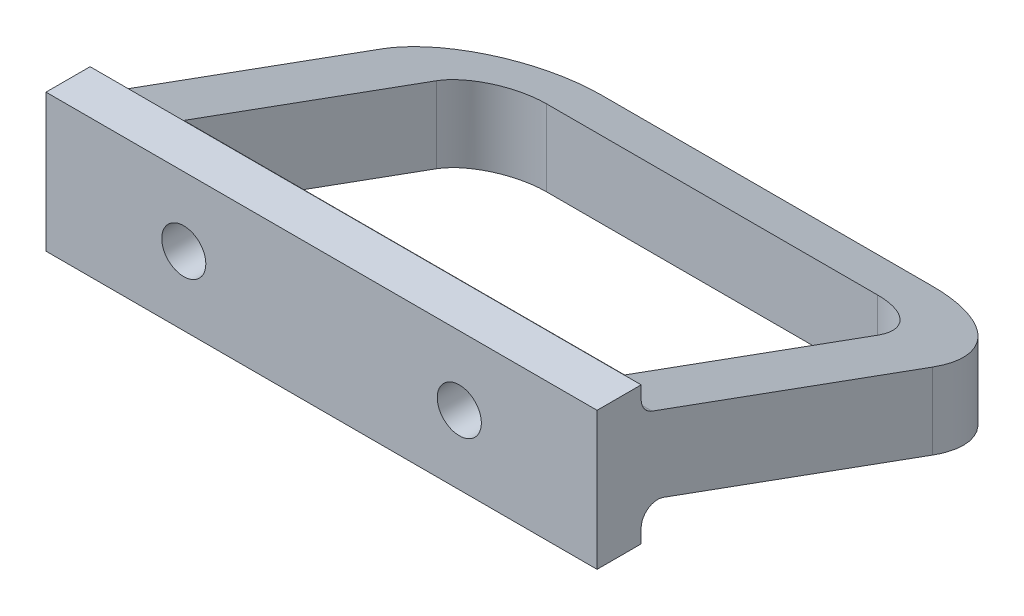
ISO-10303-21;
HEADER;
FILE_DESCRIPTION(('STEP AP214'),'2;1');
FILE_NAME('part.step','',(''),(''),'','','');
FILE_SCHEMA(('AUTOMOTIVE_DESIGN { 1 0 10303 214 1 1 1 1 }'));
ENDSEC;
DATA;
#1=APPLICATION_CONTEXT('core data for automotive mechanical design processes');
#2=APPLICATION_PROTOCOL_DEFINITION('international standard','automotive_design',2000,#1);
#3=PRODUCT_CONTEXT('',#1,'mechanical');
#4=PRODUCT('Part','Part','',(#3));
#5=PRODUCT_RELATED_PRODUCT_CATEGORY('part','',(#4));
#6=PRODUCT_DEFINITION_FORMATION('','',#4);
#7=PRODUCT_DEFINITION_CONTEXT('part definition',#1,'design');
#8=PRODUCT_DEFINITION('design','',#6,#7);
#9=PRODUCT_DEFINITION_SHAPE('','',#8);
#10=(LENGTH_UNIT() NAMED_UNIT(*) SI_UNIT(.MILLI.,.METRE.));
#11=(NAMED_UNIT(*) PLANE_ANGLE_UNIT() SI_UNIT($,.RADIAN.));
#12=(NAMED_UNIT(*) SI_UNIT($,.STERADIAN.) SOLID_ANGLE_UNIT());
#13=UNCERTAINTY_MEASURE_WITH_UNIT(LENGTH_MEASURE(1.E-05),#10,'distance_accuracy_value','');
#14=(GEOMETRIC_REPRESENTATION_CONTEXT(3) GLOBAL_UNCERTAINTY_ASSIGNED_CONTEXT((#13)) GLOBAL_UNIT_ASSIGNED_CONTEXT((#10,
#11,#12)) REPRESENTATION_CONTEXT('',''));
#15=CARTESIAN_POINT('',(0.,0.,0.));
#16=DIRECTION('',(0.,0.,1.));
#17=DIRECTION('',(1.,0.,0.));
#18=AXIS2_PLACEMENT_3D('',#15,#16,#17);
#19=CARTESIAN_POINT('',(-100.,12.5,0.));
#20=DIRECTION('',(0.,0.,1.));
#21=DIRECTION('',(0.,-1.,0.));
#22=AXIS2_PLACEMENT_3D('',#19,#20,#21);
#23=PLANE('',#22);
#24=CARTESIAN_POINT('',(-75.,0.,0.));
#25=DIRECTION('',(0.,0.,1.));
#26=DIRECTION('',(1.,0.,0.));
#27=AXIS2_PLACEMENT_3D('',#24,#25,#26);
#28=CIRCLE('',#27,4.00000000000001);
#29=CARTESIAN_POINT('',(-71.,0.,0.));
#30=VERTEX_POINT('',#29);
#31=EDGE_CURVE('E206',#30,#30,#28,.T.);
#32=ORIENTED_EDGE('',*,*,#31,.F.);
#33=EDGE_LOOP('',(#32));
#34=FACE_BOUND('',#33,.T.);
#35=CARTESIAN_POINT('',(-25.,0.,0.));
#36=DIRECTION('',(0.,0.,1.));
#37=DIRECTION('',(1.,0.,0.));
#38=AXIS2_PLACEMENT_3D('',#35,#36,#37);
#39=CIRCLE('',#38,4.);
#40=CARTESIAN_POINT('',(-21.,0.,0.));
#41=VERTEX_POINT('',#40);
#42=EDGE_CURVE('E210',#41,#41,#39,.T.);
#43=ORIENTED_EDGE('',*,*,#42,.F.);
#44=EDGE_LOOP('',(#43));
#45=FACE_BOUND('',#44,.T.);
#46=DIRECTION('',(0.,-1.,0.));
#47=VECTOR('',#46,1.);
#48=CARTESIAN_POINT('',(0.,12.5,0.));
#49=LINE('',#48,#47);
#50=CARTESIAN_POINT('',(0.,12.5,0.));
#51=VERTEX_POINT('',#50);
#52=CARTESIAN_POINT('',(0.,-12.5,0.));
#53=VERTEX_POINT('',#52);
#54=EDGE_CURVE('E258',#51,#53,#49,.T.);
#55=ORIENTED_EDGE('',*,*,#54,.F.);
#56=DIRECTION('',(1.,0.,0.));
#57=VECTOR('',#56,1.);
#58=CARTESIAN_POINT('',(-100.,12.5,0.));
#59=LINE('',#58,#57);
#60=CARTESIAN_POINT('',(-100.,12.5,0.));
#61=VERTEX_POINT('',#60);
#62=EDGE_CURVE('E327',#61,#51,#59,.T.);
#63=ORIENTED_EDGE('',*,*,#62,.F.);
#64=DIRECTION('',(0.,-1.,0.));
#65=VECTOR('',#64,1.);
#66=CARTESIAN_POINT('',(-100.,12.5,0.));
#67=LINE('',#66,#65);
#68=CARTESIAN_POINT('',(-100.,-12.5,0.));
#69=VERTEX_POINT('',#68);
#70=EDGE_CURVE('E259',#61,#69,#67,.T.);
#71=ORIENTED_EDGE('',*,*,#70,.T.);
#72=DIRECTION('',(1.,0.,0.));
#73=VECTOR('',#72,1.);
#74=CARTESIAN_POINT('',(-100.,-12.5,0.));
#75=LINE('',#74,#73);
#76=EDGE_CURVE('E294',#69,#53,#75,.T.);
#77=ORIENTED_EDGE('',*,*,#76,.T.);
#78=EDGE_LOOP('',(#55,#63,#71,#77));
#79=FACE_BOUND('',#78,.T.);
#80=ADVANCED_FACE('F45',(#34,#45,#79),#23,.T.);
#81=CARTESIAN_POINT('',(-100.,12.5,-8.));
#82=DIRECTION('',(0.,1.,0.));
#83=DIRECTION('',(0.,0.,1.));
#84=AXIS2_PLACEMENT_3D('',#81,#82,#83);
#85=PLANE('',#84);
#86=DIRECTION('',(0.,0.,1.));
#87=VECTOR('',#86,1.);
#88=CARTESIAN_POINT('',(0.,12.5,-8.));
#89=LINE('',#88,#87);
#90=CARTESIAN_POINT('',(0.,12.5,-8.));
#91=VERTEX_POINT('',#90);
#92=EDGE_CURVE('E264',#91,#51,#89,.T.);
#93=ORIENTED_EDGE('',*,*,#92,.F.);
#94=DIRECTION('',(1.,0.,0.));
#95=VECTOR('',#94,1.);
#96=CARTESIAN_POINT('',(-100.,12.5,-8.));
#97=LINE('',#96,#95);
#98=CARTESIAN_POINT('',(-100.,12.5,-8.));
#99=VERTEX_POINT('',#98);
#100=EDGE_CURVE('E331',#99,#91,#97,.T.);
#101=ORIENTED_EDGE('',*,*,#100,.F.);
#102=DIRECTION('',(0.,0.,1.));
#103=VECTOR('',#102,1.);
#104=CARTESIAN_POINT('',(-100.,12.5,-8.));
#105=LINE('',#104,#103);
#106=EDGE_CURVE('E290',#99,#61,#105,.T.);
#107=ORIENTED_EDGE('',*,*,#106,.T.);
#108=ORIENTED_EDGE('',*,*,#62,.T.);
#109=EDGE_LOOP('',(#93,#101,#107,#108));
#110=FACE_BOUND('',#109,.T.);
#111=ADVANCED_FACE('F411',(#110),#85,.T.);
#112=CARTESIAN_POINT('',(-100.,10.2002998146846,-8.00000000000001));
#113=DIRECTION('',(0.,0.,-1.));
#114=DIRECTION('',(0.,1.,0.));
#115=AXIS2_PLACEMENT_3D('',#112,#113,#114);
#116=PLANE('',#115);
#117=DIRECTION('',(0.,1.,0.));
#118=VECTOR('',#117,1.);
#119=CARTESIAN_POINT('',(0.,10.2002998146846,-8.00000000000001));
#120=LINE('',#119,#118);
#121=CARTESIAN_POINT('',(0.,10.2002998146846,-8.00000000000003));
#122=VERTEX_POINT('',#121);
#123=EDGE_CURVE('E320',#122,#91,#120,.T.);
#124=ORIENTED_EDGE('',*,*,#123,.F.);
#125=DIRECTION('',(1.,0.,0.));
#126=VECTOR('',#125,1.);
#127=CARTESIAN_POINT('',(-100.,10.2002998146846,-8.00000000000003));
#128=LINE('',#127,#126);
#129=CARTESIAN_POINT('',(-100.,10.2002998146846,-8.00000000000003));
#130=VERTEX_POINT('',#129);
#131=EDGE_CURVE('E334',#130,#122,#128,.T.);
#132=ORIENTED_EDGE('',*,*,#131,.F.);
#133=DIRECTION('',(0.,1.,0.));
#134=VECTOR('',#133,1.);
#135=CARTESIAN_POINT('',(-100.,10.2002998146846,-8.00000000000001));
#136=LINE('',#135,#134);
#137=EDGE_CURVE('E286',#130,#99,#136,.T.);
#138=ORIENTED_EDGE('',*,*,#137,.T.);
#139=ORIENTED_EDGE('',*,*,#100,.T.);
#140=EDGE_LOOP('',(#124,#132,#138,#139));
#141=FACE_BOUND('',#140,.T.);
#142=ADVANCED_FACE('F418',(#141),#116,.T.);
#143=CARTESIAN_POINT('',(-100.,10.2002998146846,-11.));
#144=DIRECTION('',(1.,0.,0.));
#145=DIRECTION('',(0.,0.,-1.));
#146=AXIS2_PLACEMENT_3D('',#143,#144,#145);
#147=CYLINDRICAL_SURFACE('',#146,2.99999999999997);
#148=CARTESIAN_POINT('',(0.,10.2002998146846,-11.));
#149=DIRECTION('',(-1.,0.,0.));
#150=DIRECTION('',(0.,0.,1.));
#151=AXIS2_PLACEMENT_3D('',#148,#149,#150);
#152=CIRCLE('',#151,2.99999999999997);
#153=CARTESIAN_POINT('',(0.,7.3812219523269,-9.97393957002299));
#154=VERTEX_POINT('',#153);
#155=EDGE_CURVE('E316',#154,#122,#152,.T.);
#156=ORIENTED_EDGE('',*,*,#155,.F.);
#157=DIRECTION('',(1.,0.,0.));
#158=VECTOR('',#157,1.);
#159=CARTESIAN_POINT('',(-100.,7.3812219523269,-9.97393957002299));
#160=LINE('',#159,#158);
#161=CARTESIAN_POINT('',(-100.,7.3812219523269,-9.97393957002299));
#162=VERTEX_POINT('',#161);
#163=EDGE_CURVE('E337',#162,#154,#160,.T.);
#164=ORIENTED_EDGE('',*,*,#163,.F.);
#165=CARTESIAN_POINT('',(-100.,10.2002998146846,-11.));
#166=DIRECTION('',(-1.,0.,0.));
#167=DIRECTION('',(0.,0.,1.));
#168=AXIS2_PLACEMENT_3D('',#165,#166,#167);
#169=CIRCLE('',#168,2.99999999999997);
#170=EDGE_CURVE('E282',#162,#130,#169,.T.);
#171=ORIENTED_EDGE('',*,*,#170,.T.);
#172=ORIENTED_EDGE('',*,*,#131,.T.);
#173=EDGE_LOOP('',(#156,#164,#171,#172));
#174=FACE_BOUND('',#173,.T.);
#175=ADVANCED_FACE('F393',(#174),#147,.F.);
#176=CARTESIAN_POINT('',(-100.,-18.4156889578132,-80.8503697873148));
#177=DIRECTION('',(0.,0.939692620785907,-0.342020143325672));
#178=DIRECTION('',(0.,0.342020143325672,0.939692620785907));
#179=AXIS2_PLACEMENT_3D('',#176,#177,#178);
#180=PLANE('',#179);
#181=DIRECTION('',(0.,-0.342020143325672,-0.939692620785907));
#182=VECTOR('',#181,1.);
#183=CARTESIAN_POINT('',(-10.,-18.4156889578132,-80.8503697873148));
#184=LINE('',#183,#182);
#185=CARTESIAN_POINT('',(-9.99999999999999,5.55188556019204,-15.));
#186=VERTEX_POINT('',#185);
#187=CARTESIAN_POINT('',(-10.,-11.1362842724891,-60.8503697873148));
#188=VERTEX_POINT('',#187);
#189=EDGE_CURVE('E195',#186,#188,#184,.T.);
#190=ORIENTED_EDGE('',*,*,#189,.F.);
#191=DIRECTION('',(1.,0.,0.));
#192=VECTOR('',#191,1.);
#193=CARTESIAN_POINT('',(-100.,5.55188556019206,-15.));
#194=LINE('',#193,#192);
#195=CARTESIAN_POINT('',(-90.,5.55188556019206,-15.));
#196=VERTEX_POINT('',#195);
#197=EDGE_CURVE('E240',#196,#186,#194,.T.);
#198=ORIENTED_EDGE('',*,*,#197,.F.);
#199=DIRECTION('',(0.,0.342020143325672,0.939692620785907));
#200=VECTOR('',#199,1.);
#201=CARTESIAN_POINT('',(-90.,-18.4156889578132,-80.8503697873148));
#202=LINE('',#201,#200);
#203=CARTESIAN_POINT('',(-90.,-11.1362842724891,-60.8503697873148));
#204=VERTEX_POINT('',#203);
#205=EDGE_CURVE('E243',#204,#196,#202,.T.);
#206=ORIENTED_EDGE('',*,*,#205,.F.);
#207=CARTESIAN_POINT('',(-80.,-11.1362842724891,-60.8503697873148));
#208=DIRECTION('',(0.,0.939692620785907,-0.342020143325672));
#209=DIRECTION('',(0.,0.342020143325672,0.939692620785907));
#210=AXIS2_PLACEMENT_3D('',#207,#208,#209);
#211=ELLIPSE('',#210,10.6417777247591,10.);
#212=CARTESIAN_POINT('',(-80.,-14.7759866151511,-70.8503697873148));
#213=VERTEX_POINT('',#212);
#214=EDGE_CURVE('E247',#213,#204,#211,.T.);
#215=ORIENTED_EDGE('',*,*,#214,.F.);
#216=DIRECTION('',(-1.,0.,0.));
#217=VECTOR('',#216,1.);
#218=CARTESIAN_POINT('',(-100.,-14.7759866151511,-70.8503697873148));
#219=LINE('',#218,#217);
#220=CARTESIAN_POINT('',(-20.,-14.7759866151512,-70.8503697873148));
#221=VERTEX_POINT('',#220);
#222=EDGE_CURVE('E250',#221,#213,#219,.T.);
#223=ORIENTED_EDGE('',*,*,#222,.F.);
#224=CARTESIAN_POINT('',(-20.,-11.1362842724891,-60.8503697873148));
#225=DIRECTION('',(0.,0.939692620785907,-0.342020143325672));
#226=DIRECTION('',(0.,0.342020143325672,0.939692620785907));
#227=AXIS2_PLACEMENT_3D('',#224,#225,#226);
#228=ELLIPSE('',#227,10.6417777247591,10.);
#229=EDGE_CURVE('E253',#188,#221,#228,.T.);
#230=ORIENTED_EDGE('',*,*,#229,.F.);
#231=EDGE_LOOP('',(#190,#198,#206,#215,#223,#230));
#232=FACE_BOUND('',#231,.T.);
#233=DIRECTION('',(1.,0.,0.));
#234=VECTOR('',#233,1.);
#235=CARTESIAN_POINT('',(-100.,-18.4156889578132,-80.8503697873148));
#236=LINE('',#235,#234);
#237=CARTESIAN_POINT('',(-80.,-18.4156889578132,-80.8503697873148));
#238=VERTEX_POINT('',#237);
#239=CARTESIAN_POINT('',(-20.,-18.4156889578132,-80.8503697873148));
#240=VERTEX_POINT('',#239);
#241=EDGE_CURVE('E341',#238,#240,#236,.T.);
#242=ORIENTED_EDGE('',*,*,#241,.F.);
#243=CARTESIAN_POINT('',(-80.,-11.1362842724891,-60.8503697873148));
#244=DIRECTION('',(0.,0.939692620785907,-0.342020143325672));
#245=DIRECTION('',(0.,0.342020143325672,0.939692620785907));
#246=AXIS2_PLACEMENT_3D('',#243,#244,#245);
#247=ELLIPSE('',#246,21.2835554495183,20.);
#248=CARTESIAN_POINT('',(-100.,-11.1362842724891,-60.8503697873148));
#249=VERTEX_POINT('',#248);
#250=EDGE_CURVE('E368',#238,#249,#247,.T.);
#251=ORIENTED_EDGE('',*,*,#250,.T.);
#252=DIRECTION('',(0.,0.342020143325672,0.939692620785907));
#253=VECTOR('',#252,1.);
#254=CARTESIAN_POINT('',(-100.,-18.4156889578132,-80.8503697873148));
#255=LINE('',#254,#253);
#256=EDGE_CURVE('E279',#249,#162,#255,.T.);
#257=ORIENTED_EDGE('',*,*,#256,.T.);
#258=ORIENTED_EDGE('',*,*,#163,.T.);
#259=DIRECTION('',(0.,0.342020143325672,0.939692620785907));
#260=VECTOR('',#259,1.);
#261=CARTESIAN_POINT('',(0.,-18.4156889578132,-80.8503697873148));
#262=LINE('',#261,#260);
#263=CARTESIAN_POINT('',(0.,-11.1362842724891,-60.8503697873148));
#264=VERTEX_POINT('',#263);
#265=EDGE_CURVE('E313',#264,#154,#262,.T.);
#266=ORIENTED_EDGE('',*,*,#265,.F.);
#267=CARTESIAN_POINT('',(-20.,-11.1362842724891,-60.8503697873148));
#268=DIRECTION('',(0.,0.939692620785907,-0.342020143325672));
#269=DIRECTION('',(0.,-0.342020143325672,-0.939692620785907));
#270=AXIS2_PLACEMENT_3D('',#267,#268,#269);
#271=ELLIPSE('',#270,21.2835554495183,20.);
#272=EDGE_CURVE('E365',#264,#240,#271,.T.);
#273=ORIENTED_EDGE('',*,*,#272,.T.);
#274=EDGE_LOOP('',(#242,#251,#257,#258,#266,#273));
#275=FACE_BOUND('',#274,.T.);
#276=ADVANCED_FACE('F385',(#232,#275),#180,.T.);
#277=CARTESIAN_POINT('',(-100.,-32.2500000000001,-80.8503697873148));
#278=DIRECTION('',(0.,0.,-1.));
#279=DIRECTION('',(-1.,0.,0.));
#280=AXIS2_PLACEMENT_3D('',#277,#278,#279);
#281=PLANE('',#280);
#282=DIRECTION('',(1.,0.,0.));
#283=VECTOR('',#282,1.);
#284=CARTESIAN_POINT('',(-100.,-32.2500000000001,-80.8503697873148));
#285=LINE('',#284,#283);
#286=CARTESIAN_POINT('',(-80.,-32.2500000000001,-80.8503697873148));
#287=VERTEX_POINT('',#286);
#288=CARTESIAN_POINT('',(-20.,-32.2500000000001,-80.8503697873148));
#289=VERTEX_POINT('',#288);
#290=EDGE_CURVE('E345',#287,#289,#285,.T.);
#291=ORIENTED_EDGE('',*,*,#290,.F.);
#292=DIRECTION('',(0.,1.,0.));
#293=VECTOR('',#292,1.);
#294=CARTESIAN_POINT('',(-80.,-32.2500000000001,-80.8503697873148));
#295=LINE('',#294,#293);
#296=EDGE_CURVE('E361',#287,#238,#295,.T.);
#297=ORIENTED_EDGE('',*,*,#296,.T.);
#298=ORIENTED_EDGE('',*,*,#241,.T.);
#299=DIRECTION('',(0.,1.,0.));
#300=VECTOR('',#299,1.);
#301=CARTESIAN_POINT('',(-20.,-32.2500000000001,-80.8503697873148));
#302=LINE('',#301,#300);
#303=EDGE_CURVE('E330',#240,#289,#302,.F.);
#304=ORIENTED_EDGE('',*,*,#303,.T.);
#305=EDGE_LOOP('',(#291,#297,#298,#304));
#306=FACE_BOUND('',#305,.T.);
#307=ADVANCED_FACE('F380',(#306),#281,.T.);
#308=CARTESIAN_POINT('',(-100.,-7.19999999999999,-12.026060429977));
#309=DIRECTION('',(0.,-0.939692620785907,0.342020143325672));
#310=DIRECTION('',(0.,-0.342020143325672,-0.939692620785907));
#311=AXIS2_PLACEMENT_3D('',#308,#309,#310);
#312=PLANE('',#311);
#313=DIRECTION('',(0.,-0.342020143325672,-0.939692620785907));
#314=VECTOR('',#313,1.);
#315=CARTESIAN_POINT('',(-10.,-21.2507525456704,-50.6301857755505));
#316=LINE('',#315,#314);
#317=CARTESIAN_POINT('',(-9.99999999999999,-8.2824254819948,-15.));
#318=VERTEX_POINT('',#317);
#319=CARTESIAN_POINT('',(-10.,-24.970595314676,-60.8503697873148));
#320=VERTEX_POINT('',#319);
#321=EDGE_CURVE('E192',#318,#320,#316,.T.);
#322=ORIENTED_EDGE('',*,*,#321,.T.);
#323=CARTESIAN_POINT('',(-20.,-24.9705953146759,-60.8503697873148));
#324=DIRECTION('',(0.,-0.939692620785907,0.342020143325672));
#325=DIRECTION('',(0.,0.342020143325672,0.939692620785907));
#326=AXIS2_PLACEMENT_3D('',#323,#324,#325);
#327=ELLIPSE('',#326,10.6417777247591,10.);
#328=CARTESIAN_POINT('',(-20.,-28.610297657338,-70.8503697873148));
#329=VERTEX_POINT('',#328);
#330=EDGE_CURVE('E176',#320,#329,#327,.F.);
#331=ORIENTED_EDGE('',*,*,#330,.T.);
#332=DIRECTION('',(-1.,0.,0.));
#333=VECTOR('',#332,1.);
#334=CARTESIAN_POINT('',(-20.,-28.610297657338,-70.8503697873148));
#335=LINE('',#334,#333);
#336=CARTESIAN_POINT('',(-80.,-28.610297657338,-70.8503697873148));
#337=VERTEX_POINT('',#336);
#338=EDGE_CURVE('E225',#329,#337,#335,.T.);
#339=ORIENTED_EDGE('',*,*,#338,.T.);
#340=CARTESIAN_POINT('',(-80.,-24.9705953146759,-60.8503697873148));
#341=DIRECTION('',(0.,-0.939692620785907,0.342020143325672));
#342=DIRECTION('',(0.,0.342020143325672,0.939692620785907));
#343=AXIS2_PLACEMENT_3D('',#340,#341,#342);
#344=ELLIPSE('',#343,10.6417777247591,10.);
#345=CARTESIAN_POINT('',(-90.,-24.9705953146759,-60.8503697873148));
#346=VERTEX_POINT('',#345);
#347=EDGE_CURVE('E220',#337,#346,#344,.F.);
#348=ORIENTED_EDGE('',*,*,#347,.T.);
#349=DIRECTION('',(0.,0.342020143325672,0.939692620785907));
#350=VECTOR('',#349,1.);
#351=CARTESIAN_POINT('',(-90.,-35.9867773450864,-91.1170811644692));
#352=LINE('',#351,#350);
#353=CARTESIAN_POINT('',(-90.,-8.28242548199479,-15.));
#354=VERTEX_POINT('',#353);
#355=EDGE_CURVE('E216',#346,#354,#352,.T.);
#356=ORIENTED_EDGE('',*,*,#355,.T.);
#357=DIRECTION('',(1.,0.,0.));
#358=VECTOR('',#357,1.);
#359=CARTESIAN_POINT('',(-90.,-8.2824254819948,-15.));
#360=LINE('',#359,#358);
#361=EDGE_CURVE('E200',#354,#318,#360,.T.);
#362=ORIENTED_EDGE('',*,*,#361,.T.);
#363=EDGE_LOOP('',(#322,#331,#339,#348,#356,#362));
#364=FACE_BOUND('',#363,.T.);
#365=DIRECTION('',(0.,-0.342020143325672,-0.939692620785907));
#366=VECTOR('',#365,1.);
#367=CARTESIAN_POINT('',(-100.,-7.19999999999999,-12.026060429977));
#368=LINE('',#367,#366);
#369=CARTESIAN_POINT('',(-100.,-7.2,-12.026060429977));
#370=VERTEX_POINT('',#369);
#371=CARTESIAN_POINT('',(-100.,-24.9705953146759,-60.8503697873148));
#372=VERTEX_POINT('',#371);
#373=EDGE_CURVE('E276',#370,#372,#368,.T.);
#374=ORIENTED_EDGE('',*,*,#373,.T.);
#375=CARTESIAN_POINT('',(-80.,-24.9705953146759,-60.8503697873148));
#376=DIRECTION('',(0.,-0.939692620785907,0.342020143325672));
#377=DIRECTION('',(0.,0.342020143325672,0.939692620785907));
#378=AXIS2_PLACEMENT_3D('',#375,#376,#377);
#379=ELLIPSE('',#378,21.2835554495183,20.);
#380=EDGE_CURVE('E54',#372,#287,#379,.T.);
#381=ORIENTED_EDGE('',*,*,#380,.T.);
#382=ORIENTED_EDGE('',*,*,#290,.T.);
#383=CARTESIAN_POINT('',(-20.,-24.9705953146759,-60.8503697873148));
#384=DIRECTION('',(0.,-0.939692620785907,0.342020143325672));
#385=DIRECTION('',(0.,-0.342020143325672,-0.939692620785907));
#386=AXIS2_PLACEMENT_3D('',#383,#384,#385);
#387=ELLIPSE('',#386,21.2835554495183,20.);
#388=CARTESIAN_POINT('',(0.,-24.9705953146759,-60.8503697873148));
#389=VERTEX_POINT('',#388);
#390=EDGE_CURVE('E61',#289,#389,#387,.T.);
#391=ORIENTED_EDGE('',*,*,#390,.T.);
#392=DIRECTION('',(0.,-0.342020143325672,-0.939692620785907));
#393=VECTOR('',#392,1.);
#394=CARTESIAN_POINT('',(0.,-7.19999999999999,-12.026060429977));
#395=LINE('',#394,#393);
#396=CARTESIAN_POINT('',(0.,-7.2,-12.026060429977));
#397=VERTEX_POINT('',#396);
#398=EDGE_CURVE('E310',#397,#389,#395,.T.);
#399=ORIENTED_EDGE('',*,*,#398,.F.);
#400=DIRECTION('',(1.,0.,0.));
#401=VECTOR('',#400,1.);
#402=CARTESIAN_POINT('',(-100.,-7.2,-12.026060429977));
#403=LINE('',#402,#401);
#404=EDGE_CURVE('E348',#370,#397,#403,.T.);
#405=ORIENTED_EDGE('',*,*,#404,.F.);
#406=EDGE_LOOP('',(#374,#381,#382,#391,#399,#405));
#407=FACE_BOUND('',#406,.T.);
#408=ADVANCED_FACE('F198',(#364,#407),#312,.T.);
#409=CARTESIAN_POINT('',(-100.,-10.0190778623577,-11.));
#410=DIRECTION('',(1.,0.,0.));
#411=DIRECTION('',(0.,0.,-1.));
#412=AXIS2_PLACEMENT_3D('',#409,#410,#411);
#413=CYLINDRICAL_SURFACE('',#412,3.);
#414=CARTESIAN_POINT('',(0.,-10.0190778623577,-11.));
#415=DIRECTION('',(-1.,0.,0.));
#416=DIRECTION('',(0.,0.,1.));
#417=AXIS2_PLACEMENT_3D('',#414,#415,#416);
#418=CIRCLE('',#417,3.);
#419=CARTESIAN_POINT('',(0.,-10.0190778623577,-8.00000000000001));
#420=VERTEX_POINT('',#419);
#421=EDGE_CURVE('E306',#420,#397,#418,.T.);
#422=ORIENTED_EDGE('',*,*,#421,.F.);
#423=DIRECTION('',(1.,0.,0.));
#424=VECTOR('',#423,1.);
#425=CARTESIAN_POINT('',(-100.,-10.0190778623577,-8.00000000000001));
#426=LINE('',#425,#424);
#427=CARTESIAN_POINT('',(-100.,-10.0190778623577,-8.00000000000001));
#428=VERTEX_POINT('',#427);
#429=EDGE_CURVE('E351',#428,#420,#426,.T.);
#430=ORIENTED_EDGE('',*,*,#429,.F.);
#431=CARTESIAN_POINT('',(-100.,-10.0190778623577,-11.));
#432=DIRECTION('',(-1.,0.,0.));
#433=DIRECTION('',(0.,0.,1.));
#434=AXIS2_PLACEMENT_3D('',#431,#432,#433);
#435=CIRCLE('',#434,3.);
#436=EDGE_CURVE('E272',#428,#370,#435,.T.);
#437=ORIENTED_EDGE('',*,*,#436,.T.);
#438=ORIENTED_EDGE('',*,*,#404,.T.);
#439=EDGE_LOOP('',(#422,#430,#437,#438));
#440=FACE_BOUND('',#439,.T.);
#441=ADVANCED_FACE('F431',(#440),#413,.F.);
#442=CARTESIAN_POINT('',(-100.,-12.5,-8.));
#443=DIRECTION('',(0.,0.,-1.));
#444=DIRECTION('',(0.,1.,0.));
#445=AXIS2_PLACEMENT_3D('',#442,#443,#444);
#446=PLANE('',#445);
#447=DIRECTION('',(0.,1.,0.));
#448=VECTOR('',#447,1.);
#449=CARTESIAN_POINT('',(0.,-12.5,-8.));
#450=LINE('',#449,#448);
#451=CARTESIAN_POINT('',(0.,-12.5,-8.));
#452=VERTEX_POINT('',#451);
#453=EDGE_CURVE('E302',#452,#420,#450,.T.);
#454=ORIENTED_EDGE('',*,*,#453,.F.);
#455=DIRECTION('',(1.,0.,0.));
#456=VECTOR('',#455,1.);
#457=CARTESIAN_POINT('',(-100.,-12.5,-8.));
#458=LINE('',#457,#456);
#459=CARTESIAN_POINT('',(-100.,-12.5,-8.));
#460=VERTEX_POINT('',#459);
#461=EDGE_CURVE('E354',#460,#452,#458,.T.);
#462=ORIENTED_EDGE('',*,*,#461,.F.);
#463=DIRECTION('',(0.,1.,0.));
#464=VECTOR('',#463,1.);
#465=CARTESIAN_POINT('',(-100.,-12.5,-8.));
#466=LINE('',#465,#464);
#467=EDGE_CURVE('E268',#460,#428,#466,.T.);
#468=ORIENTED_EDGE('',*,*,#467,.T.);
#469=ORIENTED_EDGE('',*,*,#429,.T.);
#470=EDGE_LOOP('',(#454,#462,#468,#469));
#471=FACE_BOUND('',#470,.T.);
#472=ADVANCED_FACE('F427',(#471),#446,.T.);
#473=CARTESIAN_POINT('',(-100.,-12.5,0.));
#474=DIRECTION('',(0.,-1.,0.));
#475=DIRECTION('',(0.,0.,-1.));
#476=AXIS2_PLACEMENT_3D('',#473,#474,#475);
#477=PLANE('',#476);
#478=DIRECTION('',(0.,0.,-1.));
#479=VECTOR('',#478,1.);
#480=CARTESIAN_POINT('',(0.,-12.5,0.));
#481=LINE('',#480,#479);
#482=EDGE_CURVE('E298',#53,#452,#481,.T.);
#483=ORIENTED_EDGE('',*,*,#482,.F.);
#484=ORIENTED_EDGE('',*,*,#76,.F.);
#485=DIRECTION('',(0.,0.,-1.));
#486=VECTOR('',#485,1.);
#487=CARTESIAN_POINT('',(-100.,-12.5,0.));
#488=LINE('',#487,#486);
#489=EDGE_CURVE('E263',#69,#460,#488,.T.);
#490=ORIENTED_EDGE('',*,*,#489,.T.);
#491=ORIENTED_EDGE('',*,*,#461,.T.);
#492=EDGE_LOOP('',(#483,#484,#490,#491));
#493=FACE_BOUND('',#492,.T.);
#494=ADVANCED_FACE('F424',(#493),#477,.T.);
#495=CARTESIAN_POINT('',(-100.,-10.0190778623577,-11.));
#496=DIRECTION('',(-1.,0.,0.));
#497=DIRECTION('',(0.,0.,1.));
#498=AXIS2_PLACEMENT_3D('',#495,#496,#497);
#499=PLANE('',#498);
#500=ORIENTED_EDGE('',*,*,#256,.F.);
#501=DIRECTION('',(0.,1.,0.));
#502=VECTOR('',#501,1.);
#503=CARTESIAN_POINT('',(-100.,-10.0190778623577,-60.8503697873148));
#504=LINE('',#503,#502);
#505=EDGE_CURVE('E69',#249,#372,#504,.F.);
#506=ORIENTED_EDGE('',*,*,#505,.T.);
#507=ORIENTED_EDGE('',*,*,#373,.F.);
#508=ORIENTED_EDGE('',*,*,#436,.F.);
#509=ORIENTED_EDGE('',*,*,#467,.F.);
#510=ORIENTED_EDGE('',*,*,#489,.F.);
#511=ORIENTED_EDGE('',*,*,#70,.F.);
#512=ORIENTED_EDGE('',*,*,#106,.F.);
#513=ORIENTED_EDGE('',*,*,#137,.F.);
#514=ORIENTED_EDGE('',*,*,#170,.F.);
#515=EDGE_LOOP('',(#500,#506,#507,#508,#509,#510,#511,#512,#513,#514));
#516=FACE_BOUND('',#515,.T.);
#517=ADVANCED_FACE('F388',(#516),#499,.T.);
#518=CARTESIAN_POINT('',(0.,-10.0190778623577,-11.));
#519=DIRECTION('',(-1.,0.,0.));
#520=DIRECTION('',(0.,0.,1.));
#521=AXIS2_PLACEMENT_3D('',#518,#519,#520);
#522=PLANE('',#521);
#523=ORIENTED_EDGE('',*,*,#398,.T.);
#524=DIRECTION('',(0.,1.,0.));
#525=VECTOR('',#524,1.);
#526=CARTESIAN_POINT('',(0.,-18.4156889578132,-60.8503697873148));
#527=LINE('',#526,#525);
#528=EDGE_CURVE('E11',#389,#264,#527,.T.);
#529=ORIENTED_EDGE('',*,*,#528,.T.);
#530=ORIENTED_EDGE('',*,*,#265,.T.);
#531=ORIENTED_EDGE('',*,*,#155,.T.);
#532=ORIENTED_EDGE('',*,*,#123,.T.);
#533=ORIENTED_EDGE('',*,*,#92,.T.);
#534=ORIENTED_EDGE('',*,*,#54,.T.);
#535=ORIENTED_EDGE('',*,*,#482,.T.);
#536=ORIENTED_EDGE('',*,*,#453,.T.);
#537=ORIENTED_EDGE('',*,*,#421,.T.);
#538=EDGE_LOOP('',(#523,#529,#530,#531,#532,#533,#534,#535,#536,#537));
#539=FACE_BOUND('',#538,.T.);
#540=ADVANCED_FACE('F397',(#539),#522,.F.);
#541=CARTESIAN_POINT('',(-9.99999999999999,-119.143883414968,-15.0000000000001));
#542=DIRECTION('',(1.,0.,0.));
#543=DIRECTION('',(0.,0.,-1.));
#544=AXIS2_PLACEMENT_3D('',#541,#542,#543);
#545=PLANE('',#544);
#546=ORIENTED_EDGE('',*,*,#189,.T.);
#547=DIRECTION('',(0.,1.,0.));
#548=VECTOR('',#547,1.);
#549=CARTESIAN_POINT('',(-10.,-119.143883414967,-60.8503697873148));
#550=LINE('',#549,#548);
#551=EDGE_CURVE('E179',#320,#188,#550,.T.);
#552=ORIENTED_EDGE('',*,*,#551,.F.);
#553=ORIENTED_EDGE('',*,*,#321,.F.);
#554=DIRECTION('',(0.,1.,0.));
#555=VECTOR('',#554,1.);
#556=CARTESIAN_POINT('',(-9.99999999999999,-119.143883414968,-15.0000000000001));
#557=LINE('',#556,#555);
#558=EDGE_CURVE('E214',#318,#186,#557,.T.);
#559=ORIENTED_EDGE('',*,*,#558,.T.);
#560=EDGE_LOOP('',(#546,#552,#553,#559));
#561=FACE_BOUND('',#560,.T.);
#562=ADVANCED_FACE('F190',(#561),#545,.F.);
#563=CARTESIAN_POINT('',(-20.,-119.143883414967,-60.8503697873148));
#564=DIRECTION('',(0.,1.,0.));
#565=DIRECTION('',(0.,0.,1.));
#566=AXIS2_PLACEMENT_3D('',#563,#564,#565);
#567=CYLINDRICAL_SURFACE('',#566,10.);
#568=ORIENTED_EDGE('',*,*,#229,.T.);
#569=DIRECTION('',(0.,1.,0.));
#570=VECTOR('',#569,1.);
#571=CARTESIAN_POINT('',(-20.,-119.143883414967,-70.8503697873148));
#572=LINE('',#571,#570);
#573=EDGE_CURVE('E182',#329,#221,#572,.T.);
#574=ORIENTED_EDGE('',*,*,#573,.F.);
#575=ORIENTED_EDGE('',*,*,#330,.F.);
#576=ORIENTED_EDGE('',*,*,#551,.T.);
#577=EDGE_LOOP('',(#568,#574,#575,#576));
#578=FACE_BOUND('',#577,.T.);
#579=ADVANCED_FACE('F178',(#578),#567,.F.);
#580=CARTESIAN_POINT('',(-20.,-119.143883414967,-70.8503697873148));
#581=DIRECTION('',(0.,0.,-1.));
#582=DIRECTION('',(0.,1.,0.));
#583=AXIS2_PLACEMENT_3D('',#580,#581,#582);
#584=PLANE('',#583);
#585=ORIENTED_EDGE('',*,*,#222,.T.);
#586=DIRECTION('',(0.,1.,0.));
#587=VECTOR('',#586,1.);
#588=CARTESIAN_POINT('',(-80.,-119.143883414967,-70.8503697873148));
#589=LINE('',#588,#587);
#590=EDGE_CURVE('E224',#337,#213,#589,.T.);
#591=ORIENTED_EDGE('',*,*,#590,.F.);
#592=ORIENTED_EDGE('',*,*,#338,.F.);
#593=ORIENTED_EDGE('',*,*,#573,.T.);
#594=EDGE_LOOP('',(#585,#591,#592,#593));
#595=FACE_BOUND('',#594,.T.);
#596=ADVANCED_FACE('F456',(#595),#584,.F.);
#597=CARTESIAN_POINT('',(-80.,-119.143883414967,-60.8503697873148));
#598=DIRECTION('',(0.,1.,0.));
#599=DIRECTION('',(0.,0.,1.));
#600=AXIS2_PLACEMENT_3D('',#597,#598,#599);
#601=CYLINDRICAL_SURFACE('',#600,10.);
#602=ORIENTED_EDGE('',*,*,#214,.T.);
#603=DIRECTION('',(0.,1.,0.));
#604=VECTOR('',#603,1.);
#605=CARTESIAN_POINT('',(-90.,-119.143883414967,-60.8503697873148));
#606=LINE('',#605,#604);
#607=EDGE_CURVE('E219',#346,#204,#606,.T.);
#608=ORIENTED_EDGE('',*,*,#607,.F.);
#609=ORIENTED_EDGE('',*,*,#347,.F.);
#610=ORIENTED_EDGE('',*,*,#590,.T.);
#611=EDGE_LOOP('',(#602,#608,#609,#610));
#612=FACE_BOUND('',#611,.T.);
#613=ADVANCED_FACE('F459',(#612),#601,.F.);
#614=CARTESIAN_POINT('',(-90.,-119.143883414967,-60.8503697873148));
#615=DIRECTION('',(-1.,0.,0.));
#616=DIRECTION('',(0.,0.,1.));
#617=AXIS2_PLACEMENT_3D('',#614,#615,#616);
#618=PLANE('',#617);
#619=ORIENTED_EDGE('',*,*,#205,.T.);
#620=DIRECTION('',(0.,1.,0.));
#621=VECTOR('',#620,1.);
#622=CARTESIAN_POINT('',(-90.,-119.143883414968,-15.0000000000001));
#623=LINE('',#622,#621);
#624=EDGE_CURVE('E215',#354,#196,#623,.T.);
#625=ORIENTED_EDGE('',*,*,#624,.F.);
#626=ORIENTED_EDGE('',*,*,#355,.F.);
#627=ORIENTED_EDGE('',*,*,#607,.T.);
#628=EDGE_LOOP('',(#619,#625,#626,#627));
#629=FACE_BOUND('',#628,.T.);
#630=ADVANCED_FACE('F463',(#629),#618,.F.);
#631=CARTESIAN_POINT('',(-90.,-119.143883414968,-15.0000000000001));
#632=DIRECTION('',(0.,0.,1.));
#633=DIRECTION('',(0.,-1.,0.));
#634=AXIS2_PLACEMENT_3D('',#631,#632,#633);
#635=PLANE('',#634);
#636=CARTESIAN_POINT('',(-75.,0.,-15.));
#637=DIRECTION('',(0.,0.,1.));
#638=DIRECTION('',(0.,-1.,0.));
#639=AXIS2_PLACEMENT_3D('',#636,#637,#638);
#640=CIRCLE('',#639,4.00000000000001);
#641=CARTESIAN_POINT('',(-75.,-4.00000000000001,-15.));
#642=VERTEX_POINT('',#641);
#643=EDGE_CURVE('E202',#642,#642,#640,.F.);
#644=ORIENTED_EDGE('',*,*,#643,.F.);
#645=EDGE_LOOP('',(#644));
#646=FACE_BOUND('',#645,.T.);
#647=CARTESIAN_POINT('',(-25.,0.,-15.));
#648=DIRECTION('',(0.,0.,1.));
#649=DIRECTION('',(0.,-1.,0.));
#650=AXIS2_PLACEMENT_3D('',#647,#648,#649);
#651=CIRCLE('',#650,4.);
#652=CARTESIAN_POINT('',(-25.,-4.,-15.));
#653=VERTEX_POINT('',#652);
#654=EDGE_CURVE('E481',#653,#653,#651,.F.);
#655=ORIENTED_EDGE('',*,*,#654,.F.);
#656=EDGE_LOOP('',(#655));
#657=FACE_BOUND('',#656,.T.);
#658=ORIENTED_EDGE('',*,*,#197,.T.);
#659=ORIENTED_EDGE('',*,*,#558,.F.);
#660=ORIENTED_EDGE('',*,*,#361,.F.);
#661=ORIENTED_EDGE('',*,*,#624,.T.);
#662=EDGE_LOOP('',(#658,#659,#660,#661));
#663=FACE_BOUND('',#662,.T.);
#664=ADVANCED_FACE('F410',(#646,#657,#663),#635,.F.);
#665=CARTESIAN_POINT('',(-80.,-32.2500000000001,-60.8503697873148));
#666=DIRECTION('',(0.,1.,0.));
#667=DIRECTION('',(0.,0.,1.));
#668=AXIS2_PLACEMENT_3D('',#665,#666,#667);
#669=CYLINDRICAL_SURFACE('',#668,20.);
#670=ORIENTED_EDGE('',*,*,#380,.F.);
#671=ORIENTED_EDGE('',*,*,#505,.F.);
#672=ORIENTED_EDGE('',*,*,#250,.F.);
#673=ORIENTED_EDGE('',*,*,#296,.F.);
#674=EDGE_LOOP('',(#670,#671,#672,#673));
#675=FACE_BOUND('',#674,.T.);
#676=ADVANCED_FACE('F383',(#675),#669,.T.);
#677=CARTESIAN_POINT('',(-20.,-10.0190778623577,-60.8503697873148));
#678=DIRECTION('',(0.,-1.,0.));
#679=DIRECTION('',(0.,0.,-1.));
#680=AXIS2_PLACEMENT_3D('',#677,#678,#679);
#681=CYLINDRICAL_SURFACE('',#680,20.);
#682=ORIENTED_EDGE('',*,*,#390,.F.);
#683=ORIENTED_EDGE('',*,*,#303,.F.);
#684=ORIENTED_EDGE('',*,*,#272,.F.);
#685=ORIENTED_EDGE('',*,*,#528,.F.);
#686=EDGE_LOOP('',(#682,#683,#684,#685));
#687=FACE_BOUND('',#686,.T.);
#688=ADVANCED_FACE('F47',(#687),#681,.T.);
#689=CARTESIAN_POINT('',(-25.,0.,-26.3137084989848));
#690=DIRECTION('',(0.,0.,1.));
#691=DIRECTION('',(1.,0.,0.));
#692=AXIS2_PLACEMENT_3D('',#689,#690,#691);
#693=CYLINDRICAL_SURFACE('',#692,4.);
#694=ORIENTED_EDGE('',*,*,#654,.T.);
#695=EDGE_LOOP('',(#694));
#696=FACE_BOUND('',#695,.T.);
#697=ORIENTED_EDGE('',*,*,#42,.T.);
#698=EDGE_LOOP('',(#697));
#699=FACE_BOUND('',#698,.T.);
#700=ADVANCED_FACE('F401',(#696,#699),#693,.F.);
#701=CARTESIAN_POINT('',(-75.,0.,-26.3137084989848));
#702=DIRECTION('',(0.,0.,1.));
#703=DIRECTION('',(1.,0.,0.));
#704=AXIS2_PLACEMENT_3D('',#701,#702,#703);
#705=CYLINDRICAL_SURFACE('',#704,4.00000000000001);
#706=ORIENTED_EDGE('',*,*,#643,.T.);
#707=EDGE_LOOP('',(#706));
#708=FACE_BOUND('',#707,.T.);
#709=ORIENTED_EDGE('',*,*,#31,.T.);
#710=EDGE_LOOP('',(#709));
#711=FACE_BOUND('',#710,.T.);
#712=ADVANCED_FACE('F407',(#708,#711),#705,.F.);
#713=CLOSED_SHELL('',(#80,#111,#142,#175,#276,#307,#408,#441,#472,#494,#517,#540,#562,#579,#596,
#613,#630,#664,#676,#688,#700,#712));
#714=MANIFOLD_SOLID_BREP('B2',#713);
#715=ADVANCED_BREP_SHAPE_REPRESENTATION('',(#18,#714),#14);
#716=SHAPE_DEFINITION_REPRESENTATION(#9,#715);
ENDSEC;
END-ISO-10303-21;
